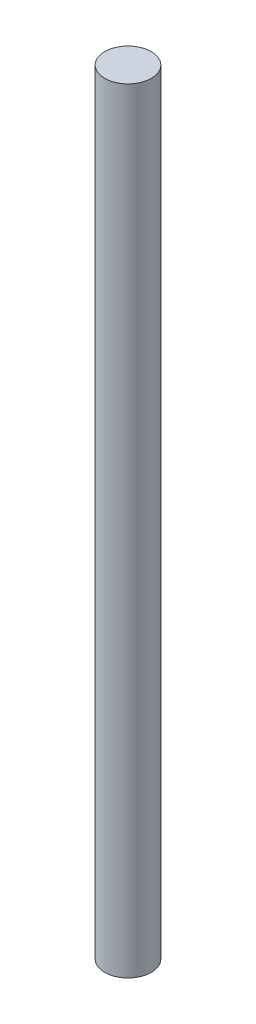
ISO-10303-21;
HEADER;
FILE_DESCRIPTION(('STEP AP214'),'2;1');
FILE_NAME('part.step','',(''),(''),'','','');
FILE_SCHEMA(('AUTOMOTIVE_DESIGN { 1 0 10303 214 1 1 1 1 }'));
ENDSEC;
DATA;
#1=APPLICATION_CONTEXT('core data for automotive mechanical design processes');
#2=APPLICATION_PROTOCOL_DEFINITION('international standard','automotive_design',2000,#1);
#3=PRODUCT_CONTEXT('',#1,'mechanical');
#4=PRODUCT('Part','Part','',(#3));
#5=PRODUCT_RELATED_PRODUCT_CATEGORY('part','',(#4));
#6=PRODUCT_DEFINITION_FORMATION('','',#4);
#7=PRODUCT_DEFINITION_CONTEXT('part definition',#1,'design');
#8=PRODUCT_DEFINITION('design','',#6,#7);
#9=PRODUCT_DEFINITION_SHAPE('','',#8);
#10=(LENGTH_UNIT() NAMED_UNIT(*) SI_UNIT(.MILLI.,.METRE.));
#11=(NAMED_UNIT(*) PLANE_ANGLE_UNIT() SI_UNIT($,.RADIAN.));
#12=(NAMED_UNIT(*) SI_UNIT($,.STERADIAN.) SOLID_ANGLE_UNIT());
#13=UNCERTAINTY_MEASURE_WITH_UNIT(LENGTH_MEASURE(1.E-05),#10,'distance_accuracy_value','');
#14=(GEOMETRIC_REPRESENTATION_CONTEXT(3) GLOBAL_UNCERTAINTY_ASSIGNED_CONTEXT((#13)) GLOBAL_UNIT_ASSIGNED_CONTEXT((#10,
#11,#12)) REPRESENTATION_CONTEXT('',''));
#15=CARTESIAN_POINT('',(0.,0.,0.));
#16=DIRECTION('',(0.,0.,1.));
#17=DIRECTION('',(1.,0.,0.));
#18=AXIS2_PLACEMENT_3D('',#15,#16,#17);
#19=CARTESIAN_POINT('',(0.,200.,0.));
#20=DIRECTION('',(0.,-1.,0.));
#21=DIRECTION('',(0.,0.,-1.));
#22=AXIS2_PLACEMENT_3D('',#19,#20,#21);
#23=CYLINDRICAL_SURFACE('',#22,6.);
#24=CARTESIAN_POINT('',(0.,200.,0.));
#25=DIRECTION('',(0.,1.,0.));
#26=DIRECTION('',(0.,0.,1.));
#27=AXIS2_PLACEMENT_3D('',#24,#25,#26);
#28=CIRCLE('',#27,6.);
#29=CARTESIAN_POINT('',(0.,200.,6.));
#30=VERTEX_POINT('',#29);
#31=EDGE_CURVE('E10',#30,#30,#28,.T.);
#32=ORIENTED_EDGE('',*,*,#31,.F.);
#33=EDGE_LOOP('',(#32));
#34=FACE_BOUND('',#33,.T.);
#35=CARTESIAN_POINT('',(0.,0.,0.));
#36=DIRECTION('',(0.,1.,0.));
#37=DIRECTION('',(0.,0.,1.));
#38=AXIS2_PLACEMENT_3D('',#35,#36,#37);
#39=CIRCLE('',#38,6.);
#40=CARTESIAN_POINT('',(0.,0.,6.));
#41=VERTEX_POINT('',#40);
#42=EDGE_CURVE('E34',#41,#41,#39,.T.);
#43=ORIENTED_EDGE('',*,*,#42,.T.);
#44=EDGE_LOOP('',(#43));
#45=FACE_BOUND('',#44,.T.);
#46=ADVANCED_FACE('F31',(#34,#45),#23,.T.);
#47=CARTESIAN_POINT('',(0.,200.,0.));
#48=DIRECTION('',(0.,1.,0.));
#49=DIRECTION('',(0.,0.,1.));
#50=AXIS2_PLACEMENT_3D('',#47,#48,#49);
#51=PLANE('',#50);
#52=ORIENTED_EDGE('',*,*,#31,.T.);
#53=EDGE_LOOP('',(#52));
#54=FACE_BOUND('',#53,.T.);
#55=ADVANCED_FACE('F46',(#54),#51,.T.);
#56=CARTESIAN_POINT('',(0.,0.,0.));
#57=DIRECTION('',(0.,1.,0.));
#58=DIRECTION('',(0.,0.,1.));
#59=AXIS2_PLACEMENT_3D('',#56,#57,#58);
#60=PLANE('',#59);
#61=ORIENTED_EDGE('',*,*,#42,.F.);
#62=EDGE_LOOP('',(#61));
#63=FACE_BOUND('',#62,.T.);
#64=ADVANCED_FACE('F44',(#63),#60,.F.);
#65=CLOSED_SHELL('',(#46,#55,#64));
#66=MANIFOLD_SOLID_BREP('B2',#65);
#67=ADVANCED_BREP_SHAPE_REPRESENTATION('',(#18,#66),#14);
#68=SHAPE_DEFINITION_REPRESENTATION(#9,#67);
ENDSEC;
END-ISO-10303-21;
